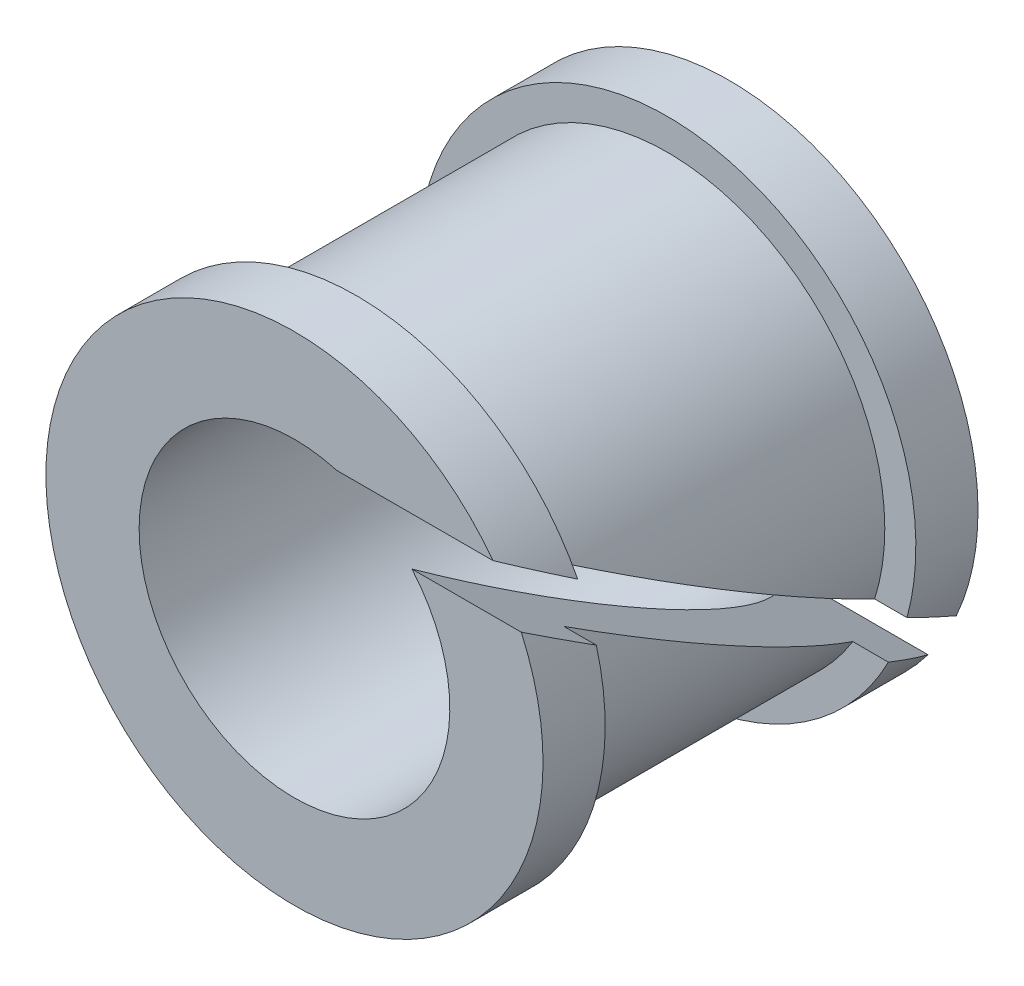
ISO-10303-21;
HEADER;
FILE_DESCRIPTION(('STEP AP214'),'2;1');
FILE_NAME('part.step','',(''),(''),'','','');
FILE_SCHEMA(('AUTOMOTIVE_DESIGN { 1 0 10303 214 1 1 1 1 }'));
ENDSEC;
DATA;
#1=APPLICATION_CONTEXT('core data for automotive mechanical design processes');
#2=APPLICATION_PROTOCOL_DEFINITION('international standard','automotive_design',2000,#1);
#3=PRODUCT_CONTEXT('',#1,'mechanical');
#4=PRODUCT('Part','Part','',(#3));
#5=PRODUCT_RELATED_PRODUCT_CATEGORY('part','',(#4));
#6=PRODUCT_DEFINITION_FORMATION('','',#4);
#7=PRODUCT_DEFINITION_CONTEXT('part definition',#1,'design');
#8=PRODUCT_DEFINITION('design','',#6,#7);
#9=PRODUCT_DEFINITION_SHAPE('','',#8);
#10=(LENGTH_UNIT() NAMED_UNIT(*) SI_UNIT(.MILLI.,.METRE.));
#11=(NAMED_UNIT(*) PLANE_ANGLE_UNIT() SI_UNIT($,.RADIAN.));
#12=(NAMED_UNIT(*) SI_UNIT($,.STERADIAN.) SOLID_ANGLE_UNIT());
#13=UNCERTAINTY_MEASURE_WITH_UNIT(LENGTH_MEASURE(1.E-05),#10,'distance_accuracy_value','');
#14=(GEOMETRIC_REPRESENTATION_CONTEXT(3) GLOBAL_UNCERTAINTY_ASSIGNED_CONTEXT((#13)) GLOBAL_UNIT_ASSIGNED_CONTEXT((#10,
#11,#12)) REPRESENTATION_CONTEXT('',''));
#15=CARTESIAN_POINT('',(0.,0.,0.));
#16=DIRECTION('',(0.,0.,1.));
#17=DIRECTION('',(1.,0.,0.));
#18=AXIS2_PLACEMENT_3D('',#15,#16,#17);
#19=CARTESIAN_POINT('',(0.,0.,2.1));
#20=DIRECTION('',(0.,0.,1.));
#21=DIRECTION('',(1.,0.,0.));
#22=AXIS2_PLACEMENT_3D('',#19,#20,#21);
#23=CYLINDRICAL_SURFACE('',#22,2.4);
#24=CARTESIAN_POINT('',(0.,0.,0.4));
#25=DIRECTION('',(0.,0.866025403784438,-0.500000000000001));
#26=DIRECTION('',(0.,0.500000000000001,0.866025403784438));
#27=AXIS2_PLACEMENT_3D('',#24,#25,#26);
#28=ELLIPSE('',#27,4.79999999999999,2.4);
#29=CARTESIAN_POINT('',(2.19012937213003,0.981495457622366,2.1));
#30=VERTEX_POINT('',#29);
#31=CARTESIAN_POINT('',(2.31444737824533,0.63508529610859,1.5));
#32=VERTEX_POINT('',#31);
#33=EDGE_CURVE('E114',#30,#32,#28,.T.);
#34=ORIENTED_EDGE('',*,*,#33,.F.);
#35=CARTESIAN_POINT('',(0.,0.,2.1));
#36=DIRECTION('',(0.,0.,1.));
#37=DIRECTION('',(1.,0.,0.));
#38=AXIS2_PLACEMENT_3D('',#35,#36,#37);
#39=CIRCLE('',#38,2.4);
#40=CARTESIAN_POINT('',(1.91746360243595,1.44337567297407,2.1));
#41=VERTEX_POINT('',#40);
#42=EDGE_CURVE('E109',#41,#30,#39,.T.);
#43=ORIENTED_EDGE('',*,*,#42,.F.);
#44=CARTESIAN_POINT('',(0.,0.,-0.4));
#45=DIRECTION('',(0.,-0.866025403784438,0.500000000000001));
#46=DIRECTION('',(0.,0.500000000000001,0.866025403784438));
#47=AXIS2_PLACEMENT_3D('',#44,#45,#46);
#48=ELLIPSE('',#47,4.79999999999999,2.4);
#49=CARTESIAN_POINT('',(2.13463501954471,1.09696551146029,1.5));
#50=VERTEX_POINT('',#49);
#51=EDGE_CURVE('E94',#50,#41,#48,.T.);
#52=ORIENTED_EDGE('',*,*,#51,.F.);
#53=CARTESIAN_POINT('',(0.,0.,1.5));
#54=DIRECTION('',(0.,0.,1.));
#55=DIRECTION('',(1.,0.,0.));
#56=AXIS2_PLACEMENT_3D('',#53,#54,#55);
#57=CIRCLE('',#56,2.4);
#58=EDGE_CURVE('E133',#50,#32,#57,.T.);
#59=ORIENTED_EDGE('',*,*,#58,.T.);
#60=EDGE_LOOP('',(#34,#43,#52,#59));
#61=FACE_BOUND('',#60,.T.);
#62=ADVANCED_FACE('F33',(#61),#23,.T.);
#63=CARTESIAN_POINT('',(0.,2.4,1.5));
#64=DIRECTION('',(0.,0.,1.));
#65=DIRECTION('',(1.,0.,0.));
#66=AXIS2_PLACEMENT_3D('',#63,#64,#65);
#67=PLANE('',#66);
#68=DIRECTION('',(-1.,0.,0.));
#69=VECTOR('',#68,1.);
#70=CARTESIAN_POINT('',(0.,0.63508529610859,1.5));
#71=LINE('',#70,#69);
#72=CARTESIAN_POINT('',(2.00166597280032,0.63508529610859,1.5));
#73=VERTEX_POINT('',#72);
#74=EDGE_CURVE('E147',#32,#73,#71,.T.);
#75=ORIENTED_EDGE('',*,*,#74,.F.);
#76=ORIENTED_EDGE('',*,*,#58,.F.);
#77=DIRECTION('',(1.,0.,0.));
#78=VECTOR('',#77,1.);
#79=CARTESIAN_POINT('',(0.,1.09696551146029,1.5));
#80=LINE('',#79,#78);
#81=CARTESIAN_POINT('',(1.79071680247511,1.09696551146029,1.5));
#82=VERTEX_POINT('',#81);
#83=EDGE_CURVE('E97',#82,#50,#80,.T.);
#84=ORIENTED_EDGE('',*,*,#83,.F.);
#85=CARTESIAN_POINT('',(0.,0.,1.5));
#86=DIRECTION('',(0.,0.,1.));
#87=DIRECTION('',(1.,0.,0.));
#88=AXIS2_PLACEMENT_3D('',#85,#86,#87);
#89=CIRCLE('',#88,2.1);
#90=EDGE_CURVE('E130',#82,#73,#89,.T.);
#91=ORIENTED_EDGE('',*,*,#90,.T.);
#92=EDGE_LOOP('',(#75,#76,#84,#91));
#93=FACE_BOUND('',#92,.T.);
#94=ADVANCED_FACE('F175',(#93),#67,.F.);
#95=CARTESIAN_POINT('',(0.,0.,2.1));
#96=DIRECTION('',(0.,0.,1.));
#97=DIRECTION('',(1.,0.,0.));
#98=AXIS2_PLACEMENT_3D('',#95,#96,#97);
#99=CYLINDRICAL_SURFACE('',#98,2.1);
#100=CARTESIAN_POINT('',(0.,0.,0.4));
#101=DIRECTION('',(0.,0.866025403784438,-0.500000000000001));
#102=DIRECTION('',(0.,0.500000000000001,0.866025403784438));
#103=AXIS2_PLACEMENT_3D('',#100,#101,#102);
#104=ELLIPSE('',#103,4.19999999999999,2.1);
#105=CARTESIAN_POINT('',(1.79071680247511,-1.09696551146029,-1.5));
#106=VERTEX_POINT('',#105);
#107=EDGE_CURVE('E152',#73,#106,#104,.T.);
#108=ORIENTED_EDGE('',*,*,#107,.F.);
#109=ORIENTED_EDGE('',*,*,#90,.F.);
#110=CARTESIAN_POINT('',(0.,0.,-0.4));
#111=DIRECTION('',(0.,-0.866025403784438,0.500000000000001));
#112=DIRECTION('',(0.,0.500000000000001,0.866025403784438));
#113=AXIS2_PLACEMENT_3D('',#110,#111,#112);
#114=ELLIPSE('',#113,4.19999999999999,2.1);
#115=CARTESIAN_POINT('',(2.00166597280032,-0.63508529610859,-1.5));
#116=VERTEX_POINT('',#115);
#117=EDGE_CURVE('E166',#116,#82,#114,.T.);
#118=ORIENTED_EDGE('',*,*,#117,.F.);
#119=CARTESIAN_POINT('',(0.,0.,-1.5));
#120=DIRECTION('',(0.,0.,1.));
#121=DIRECTION('',(1.,0.,0.));
#122=AXIS2_PLACEMENT_3D('',#119,#120,#121);
#123=CIRCLE('',#122,2.1);
#124=EDGE_CURVE('E127',#116,#106,#123,.T.);
#125=ORIENTED_EDGE('',*,*,#124,.T.);
#126=EDGE_LOOP('',(#108,#109,#118,#125));
#127=FACE_BOUND('',#126,.T.);
#128=ADVANCED_FACE('F177',(#127),#99,.T.);
#129=CARTESIAN_POINT('',(0.,2.1,-1.5));
#130=DIRECTION('',(0.,0.,-1.));
#131=DIRECTION('',(-1.,0.,0.));
#132=AXIS2_PLACEMENT_3D('',#129,#130,#131);
#133=PLANE('',#132);
#134=DIRECTION('',(1.,0.,0.));
#135=VECTOR('',#134,1.);
#136=CARTESIAN_POINT('',(0.,-1.09696551146029,-1.5));
#137=LINE('',#136,#135);
#138=CARTESIAN_POINT('',(2.13463501954471,-1.09696551146029,-1.5));
#139=VERTEX_POINT('',#138);
#140=EDGE_CURVE('E154',#106,#139,#137,.T.);
#141=ORIENTED_EDGE('',*,*,#140,.F.);
#142=ORIENTED_EDGE('',*,*,#124,.F.);
#143=DIRECTION('',(-1.,0.,0.));
#144=VECTOR('',#143,1.);
#145=CARTESIAN_POINT('',(0.,-0.63508529610859,-1.5));
#146=LINE('',#145,#144);
#147=CARTESIAN_POINT('',(2.31444737824533,-0.635085296108591,-1.5));
#148=VERTEX_POINT('',#147);
#149=EDGE_CURVE('E164',#148,#116,#146,.T.);
#150=ORIENTED_EDGE('',*,*,#149,.F.);
#151=CARTESIAN_POINT('',(0.,0.,-1.5));
#152=DIRECTION('',(0.,0.,1.));
#153=DIRECTION('',(1.,0.,0.));
#154=AXIS2_PLACEMENT_3D('',#151,#152,#153);
#155=CIRCLE('',#154,2.4);
#156=EDGE_CURVE('E119',#148,#139,#155,.T.);
#157=ORIENTED_EDGE('',*,*,#156,.T.);
#158=EDGE_LOOP('',(#141,#142,#150,#157));
#159=FACE_BOUND('',#158,.T.);
#160=ADVANCED_FACE('F179',(#159),#133,.F.);
#161=CARTESIAN_POINT('',(0.,0.,2.1));
#162=DIRECTION('',(0.,0.,1.));
#163=DIRECTION('',(1.,0.,0.));
#164=AXIS2_PLACEMENT_3D('',#161,#162,#163);
#165=CYLINDRICAL_SURFACE('',#164,2.4);
#166=CARTESIAN_POINT('',(0.,0.,0.4));
#167=DIRECTION('',(0.,0.866025403784438,-0.500000000000001));
#168=DIRECTION('',(0.,0.500000000000001,0.866025403784438));
#169=AXIS2_PLACEMENT_3D('',#166,#167,#168);
#170=ELLIPSE('',#169,4.79999999999999,2.4);
#171=CARTESIAN_POINT('',(1.91746360243595,-1.44337567297407,-2.1));
#172=VERTEX_POINT('',#171);
#173=EDGE_CURVE('E156',#139,#172,#170,.T.);
#174=ORIENTED_EDGE('',*,*,#173,.F.);
#175=ORIENTED_EDGE('',*,*,#156,.F.);
#176=CARTESIAN_POINT('',(0.,0.,-0.4));
#177=DIRECTION('',(0.,-0.866025403784438,0.500000000000001));
#178=DIRECTION('',(0.,0.500000000000001,0.866025403784438));
#179=AXIS2_PLACEMENT_3D('',#176,#177,#178);
#180=ELLIPSE('',#179,4.79999999999999,2.4);
#181=CARTESIAN_POINT('',(2.19012937213003,-0.981495457622367,-2.1));
#182=VERTEX_POINT('',#181);
#183=EDGE_CURVE('E142',#182,#148,#180,.T.);
#184=ORIENTED_EDGE('',*,*,#183,.F.);
#185=CARTESIAN_POINT('',(0.,0.,-2.1));
#186=DIRECTION('',(0.,0.,1.));
#187=DIRECTION('',(1.,0.,0.));
#188=AXIS2_PLACEMENT_3D('',#185,#186,#187);
#189=CIRCLE('',#188,2.4);
#190=EDGE_CURVE('E115',#182,#172,#189,.T.);
#191=ORIENTED_EDGE('',*,*,#190,.T.);
#192=EDGE_LOOP('',(#174,#175,#184,#191));
#193=FACE_BOUND('',#192,.T.);
#194=ADVANCED_FACE('F162',(#193),#165,.T.);
#195=CARTESIAN_POINT('',(0.,2.4,-2.1));
#196=DIRECTION('',(0.,0.,1.));
#197=DIRECTION('',(1.,0.,0.));
#198=AXIS2_PLACEMENT_3D('',#195,#196,#197);
#199=PLANE('',#198);
#200=DIRECTION('',(-1.,0.,0.));
#201=VECTOR('',#200,1.);
#202=CARTESIAN_POINT('',(2.4,-1.44337567297407,-2.1));
#203=LINE('',#202,#201);
#204=CARTESIAN_POINT('',(0.408248290463851,-1.44337567297407,-2.1));
#205=VERTEX_POINT('',#204);
#206=EDGE_CURVE('E54',#172,#205,#203,.T.);
#207=ORIENTED_EDGE('',*,*,#206,.F.);
#208=ORIENTED_EDGE('',*,*,#190,.F.);
#209=DIRECTION('',(1.,0.,0.));
#210=VECTOR('',#209,1.);
#211=CARTESIAN_POINT('',(0.,-0.981495457622367,-2.1));
#212=LINE('',#211,#210);
#213=CARTESIAN_POINT('',(1.13431330181157,-0.981495457622367,-2.1));
#214=VERTEX_POINT('',#213);
#215=EDGE_CURVE('E135',#214,#182,#212,.T.);
#216=ORIENTED_EDGE('',*,*,#215,.F.);
#217=CARTESIAN_POINT('',(0.,0.,-2.1));
#218=DIRECTION('',(0.,0.,1.));
#219=DIRECTION('',(1.,0.,0.));
#220=AXIS2_PLACEMENT_3D('',#217,#218,#219);
#221=CIRCLE('',#220,1.5);
#222=EDGE_CURVE('E116',#214,#205,#221,.T.);
#223=ORIENTED_EDGE('',*,*,#222,.T.);
#224=EDGE_LOOP('',(#207,#208,#216,#223));
#225=FACE_BOUND('',#224,.T.);
#226=ADVANCED_FACE('F141',(#225),#199,.F.);
#227=CARTESIAN_POINT('',(0.,0.,2.1));
#228=DIRECTION('',(0.,0.,-1.));
#229=DIRECTION('',(-1.,0.,0.));
#230=AXIS2_PLACEMENT_3D('',#227,#228,#229);
#231=PLANE('',#230);
#232=DIRECTION('',(1.,0.,0.));
#233=VECTOR('',#232,1.);
#234=CARTESIAN_POINT('',(0.,0.981495457622366,2.1));
#235=LINE('',#234,#233);
#236=CARTESIAN_POINT('',(1.13431330181157,0.981495457622366,2.1));
#237=VERTEX_POINT('',#236);
#238=EDGE_CURVE('E102',#237,#30,#235,.T.);
#239=ORIENTED_EDGE('',*,*,#238,.F.);
#240=CARTESIAN_POINT('',(0.,0.,2.1));
#241=DIRECTION('',(0.,0.,1.));
#242=DIRECTION('',(1.,0.,0.));
#243=AXIS2_PLACEMENT_3D('',#240,#241,#242);
#244=CIRCLE('',#243,1.5);
#245=CARTESIAN_POINT('',(0.408248290463849,1.44337567297407,2.1));
#246=VERTEX_POINT('',#245);
#247=EDGE_CURVE('E111',#246,#237,#244,.T.);
#248=ORIENTED_EDGE('',*,*,#247,.F.);
#249=DIRECTION('',(-1.,0.,0.));
#250=VECTOR('',#249,1.);
#251=CARTESIAN_POINT('',(2.4,1.44337567297407,2.1));
#252=LINE('',#251,#250);
#253=EDGE_CURVE('E47',#41,#246,#252,.T.);
#254=ORIENTED_EDGE('',*,*,#253,.F.);
#255=ORIENTED_EDGE('',*,*,#42,.T.);
#256=EDGE_LOOP('',(#239,#248,#254,#255));
#257=FACE_BOUND('',#256,.T.);
#258=ADVANCED_FACE('F108',(#257),#231,.F.);
#259=CARTESIAN_POINT('',(0.,0.,2.1));
#260=DIRECTION('',(0.,0.,1.));
#261=DIRECTION('',(1.,0.,0.));
#262=AXIS2_PLACEMENT_3D('',#259,#260,#261);
#263=CYLINDRICAL_SURFACE('',#262,1.5);
#264=CARTESIAN_POINT('',(0.,0.,0.4));
#265=DIRECTION('',(0.,0.866025403784438,-0.500000000000001));
#266=DIRECTION('',(0.,0.500000000000001,0.866025403784438));
#267=AXIS2_PLACEMENT_3D('',#264,#265,#266);
#268=ELLIPSE('',#267,2.99999999999999,1.5);
#269=EDGE_CURVE('E11',#205,#237,#268,.F.);
#270=ORIENTED_EDGE('',*,*,#269,.F.);
#271=ORIENTED_EDGE('',*,*,#222,.F.);
#272=CARTESIAN_POINT('',(0.,0.,-0.4));
#273=DIRECTION('',(0.,-0.866025403784438,0.500000000000001));
#274=DIRECTION('',(0.,0.500000000000001,0.866025403784438));
#275=AXIS2_PLACEMENT_3D('',#272,#273,#274);
#276=ELLIPSE('',#275,2.99999999999999,1.5);
#277=EDGE_CURVE('E40',#246,#214,#276,.F.);
#278=ORIENTED_EDGE('',*,*,#277,.F.);
#279=ORIENTED_EDGE('',*,*,#247,.T.);
#280=EDGE_LOOP('',(#270,#271,#278,#279));
#281=FACE_BOUND('',#280,.T.);
#282=ADVANCED_FACE('F144',(#281),#263,.F.);
#283=CARTESIAN_POINT('',(2.4,1.44337567297407,2.1));
#284=DIRECTION('',(0.,-0.866025403784438,0.500000000000001));
#285=DIRECTION('',(0.,-0.500000000000001,-0.866025403784438));
#286=AXIS2_PLACEMENT_3D('',#283,#284,#285);
#287=PLANE('',#286);
#288=ORIENTED_EDGE('',*,*,#51,.T.);
#289=ORIENTED_EDGE('',*,*,#253,.T.);
#290=ORIENTED_EDGE('',*,*,#277,.T.);
#291=ORIENTED_EDGE('',*,*,#215,.T.);
#292=ORIENTED_EDGE('',*,*,#183,.T.);
#293=ORIENTED_EDGE('',*,*,#149,.T.);
#294=ORIENTED_EDGE('',*,*,#117,.T.);
#295=ORIENTED_EDGE('',*,*,#83,.T.);
#296=EDGE_LOOP('',(#288,#289,#290,#291,#292,#293,#294,#295));
#297=FACE_BOUND('',#296,.T.);
#298=ADVANCED_FACE('F95',(#297),#287,.T.);
#299=CARTESIAN_POINT('',(2.4,1.09696551146029,2.3));
#300=DIRECTION('',(0.,0.866025403784438,-0.500000000000001));
#301=DIRECTION('',(0.,0.500000000000001,0.866025403784438));
#302=AXIS2_PLACEMENT_3D('',#299,#300,#301);
#303=PLANE('',#302);
#304=ORIENTED_EDGE('',*,*,#173,.T.);
#305=ORIENTED_EDGE('',*,*,#206,.T.);
#306=ORIENTED_EDGE('',*,*,#269,.T.);
#307=ORIENTED_EDGE('',*,*,#238,.T.);
#308=ORIENTED_EDGE('',*,*,#33,.T.);
#309=ORIENTED_EDGE('',*,*,#74,.T.);
#310=ORIENTED_EDGE('',*,*,#107,.T.);
#311=ORIENTED_EDGE('',*,*,#140,.T.);
#312=EDGE_LOOP('',(#304,#305,#306,#307,#308,#309,#310,#311));
#313=FACE_BOUND('',#312,.T.);
#314=ADVANCED_FACE('F145',(#313),#303,.T.);
#315=CLOSED_SHELL('',(#62,#94,#128,#160,#194,#226,#258,#282,#298,#314));
#316=MANIFOLD_SOLID_BREP('B2',#315);
#317=ADVANCED_BREP_SHAPE_REPRESENTATION('',(#18,#316),#14);
#318=SHAPE_DEFINITION_REPRESENTATION(#9,#317);
ENDSEC;
END-ISO-10303-21;
